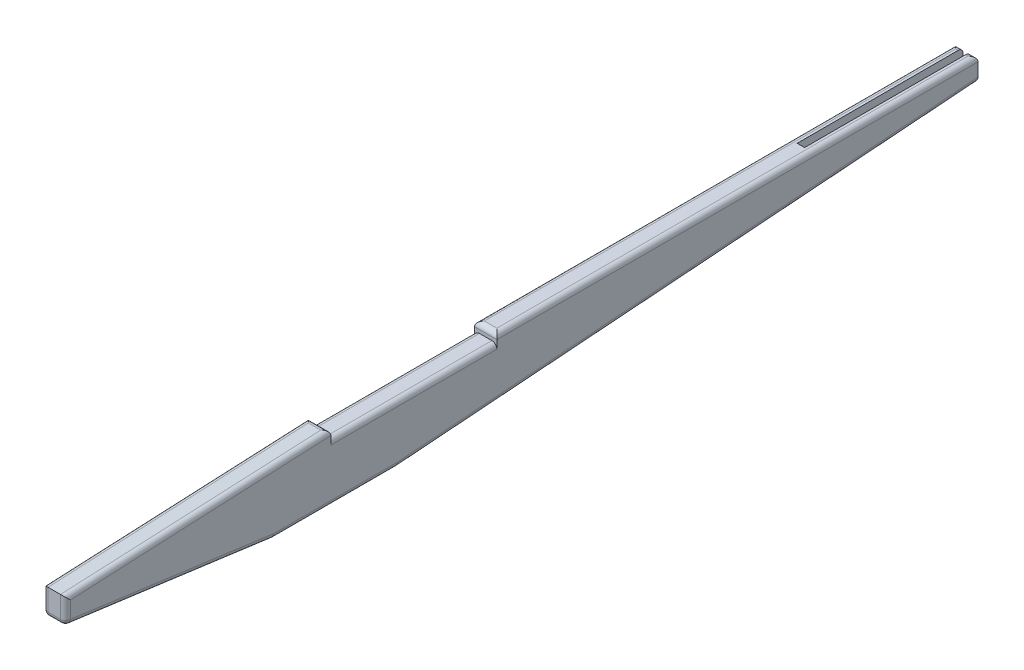
ISO-10303-21;
HEADER;
FILE_DESCRIPTION(('STEP AP214'),'2;1');
FILE_NAME('part.step','',(''),(''),'','','');
FILE_SCHEMA(('AUTOMOTIVE_DESIGN { 1 0 10303 214 1 1 1 1 }'));
ENDSEC;
DATA;
#1=APPLICATION_CONTEXT('core data for automotive mechanical design processes');
#2=APPLICATION_PROTOCOL_DEFINITION('international standard','automotive_design',2000,#1);
#3=PRODUCT_CONTEXT('',#1,'mechanical');
#4=PRODUCT('Part','Part','',(#3));
#5=PRODUCT_RELATED_PRODUCT_CATEGORY('part','',(#4));
#6=PRODUCT_DEFINITION_FORMATION('','',#4);
#7=PRODUCT_DEFINITION_CONTEXT('part definition',#1,'design');
#8=PRODUCT_DEFINITION('design','',#6,#7);
#9=PRODUCT_DEFINITION_SHAPE('','',#8);
#10=(LENGTH_UNIT() NAMED_UNIT(*) SI_UNIT(.MILLI.,.METRE.));
#11=(NAMED_UNIT(*) PLANE_ANGLE_UNIT() SI_UNIT($,.RADIAN.));
#12=(NAMED_UNIT(*) SI_UNIT($,.STERADIAN.) SOLID_ANGLE_UNIT());
#13=UNCERTAINTY_MEASURE_WITH_UNIT(LENGTH_MEASURE(1.E-05),#10,'distance_accuracy_value','');
#14=(GEOMETRIC_REPRESENTATION_CONTEXT(3) GLOBAL_UNCERTAINTY_ASSIGNED_CONTEXT((#13)) GLOBAL_UNIT_ASSIGNED_CONTEXT((#10,
#11,#12)) REPRESENTATION_CONTEXT('',''));
#15=CARTESIAN_POINT('',(0.,0.,0.));
#16=DIRECTION('',(0.,0.,1.));
#17=DIRECTION('',(1.,0.,0.));
#18=AXIS2_PLACEMENT_3D('',#15,#16,#17);
#19=CARTESIAN_POINT('',(13.5,32.5,0.));
#20=DIRECTION('',(0.,-0.998903174369838,-0.0468235862985862));
#21=DIRECTION('',(0.,0.0468235862985862,-0.998903174369838));
#22=AXIS2_PLACEMENT_3D('',#19,#20,#21);
#23=PLANE('',#22);
#24=DIRECTION('',(-1.,0.,0.));
#25=VECTOR('',#24,1.);
#26=CARTESIAN_POINT('',(13.5,39.8527904331768,-156.859529241104));
#27=LINE('',#26,#25);
#28=CARTESIAN_POINT('',(10.5,39.8527904331768,-156.859529241104));
#29=VERTEX_POINT('',#28);
#30=CARTESIAN_POINT('',(3.,39.8527904331768,-156.859529241104));
#31=VERTEX_POINT('',#30);
#32=EDGE_CURVE('E52',#29,#31,#27,.T.);
#33=ORIENTED_EDGE('',*,*,#32,.T.);
#34=DIRECTION('',(0.,-0.0468235862985862,0.998903174369838));
#35=VECTOR('',#34,1.);
#36=CARTESIAN_POINT('',(3.,32.5,0.));
#37=LINE('',#36,#35);
#38=CARTESIAN_POINT('',(3.,32.5,0.));
#39=VERTEX_POINT('',#38);
#40=EDGE_CURVE('E394',#31,#39,#37,.T.);
#41=ORIENTED_EDGE('',*,*,#40,.T.);
#42=DIRECTION('',(-1.,0.,0.));
#43=VECTOR('',#42,1.);
#44=CARTESIAN_POINT('',(13.5,32.5,0.));
#45=LINE('',#44,#43);
#46=CARTESIAN_POINT('',(10.5,32.5,0.));
#47=VERTEX_POINT('',#46);
#48=EDGE_CURVE('E293',#47,#39,#45,.T.);
#49=ORIENTED_EDGE('',*,*,#48,.F.);
#50=DIRECTION('',(0.,-0.0468235862985862,0.998903174369838));
#51=VECTOR('',#50,1.);
#52=CARTESIAN_POINT('',(10.5,32.5,0.));
#53=LINE('',#52,#51);
#54=EDGE_CURVE('E57',#47,#29,#53,.F.);
#55=ORIENTED_EDGE('',*,*,#54,.T.);
#56=EDGE_LOOP('',(#33,#41,#49,#55));
#57=FACE_BOUND('',#56,.T.);
#58=ADVANCED_FACE('F35',(#57),#23,.F.);
#59=CARTESIAN_POINT('',(13.5,16.9,0.));
#60=DIRECTION('',(0.,0.,-1.));
#61=DIRECTION('',(-1.,0.,0.));
#62=AXIS2_PLACEMENT_3D('',#59,#60,#61);
#63=PLANE('',#62);
#64=ORIENTED_EDGE('',*,*,#48,.T.);
#65=DIRECTION('',(0.,-1.,0.));
#66=VECTOR('',#65,1.);
#67=CARTESIAN_POINT('',(3.,16.9,0.));
#68=LINE('',#67,#66);
#69=CARTESIAN_POINT('',(3.,19.5225355480754,0.));
#70=VERTEX_POINT('',#69);
#71=EDGE_CURVE('E383',#39,#70,#68,.T.);
#72=ORIENTED_EDGE('',*,*,#71,.T.);
#73=DIRECTION('',(-1.,0.,0.));
#74=VECTOR('',#73,1.);
#75=CARTESIAN_POINT('',(13.5,19.5225355480754,0.));
#76=LINE('',#75,#74);
#77=CARTESIAN_POINT('',(10.5,19.5225355480754,0.));
#78=VERTEX_POINT('',#77);
#79=EDGE_CURVE('E380',#70,#78,#76,.F.);
#80=ORIENTED_EDGE('',*,*,#79,.T.);
#81=DIRECTION('',(0.,-1.,0.));
#82=VECTOR('',#81,1.);
#83=CARTESIAN_POINT('',(10.5,16.9,0.));
#84=LINE('',#83,#82);
#85=EDGE_CURVE('E378',#78,#47,#84,.F.);
#86=ORIENTED_EDGE('',*,*,#85,.T.);
#87=EDGE_LOOP('',(#64,#72,#80,#86));
#88=FACE_BOUND('',#87,.T.);
#89=ADVANCED_FACE('F485',(#88),#63,.F.);
#90=CARTESIAN_POINT('',(13.5,0.,-125.3));
#91=DIRECTION('',(0.,0.99102644098544,-0.133665976477685));
#92=DIRECTION('',(0.,0.133665976477685,0.99102644098544));
#93=AXIS2_PLACEMENT_3D('',#90,#91,#92);
#94=PLANE('',#93);
#95=DIRECTION('',(0.,-0.133665976477685,-0.99102644098544));
#96=VECTOR('',#95,1.);
#97=CARTESIAN_POINT('',(3.,0.,-125.3));
#98=LINE('',#97,#96);
#99=CARTESIAN_POINT('',(3.,16.5494562251191,-2.59900207056695));
#100=VERTEX_POINT('',#99);
#101=CARTESIAN_POINT('',(3.,0.026920677043683,-125.100404684404));
#102=VERTEX_POINT('',#101);
#103=EDGE_CURVE('E373',#100,#102,#98,.T.);
#104=ORIENTED_EDGE('',*,*,#103,.T.);
#105=DIRECTION('',(-1.,0.,0.));
#106=VECTOR('',#105,1.);
#107=CARTESIAN_POINT('',(13.5,0.026920677043683,-125.100404684404));
#108=LINE('',#107,#106);
#109=CARTESIAN_POINT('',(10.5,0.026920677043683,-125.100404684404));
#110=VERTEX_POINT('',#109);
#111=EDGE_CURVE('E375',#102,#110,#108,.F.);
#112=ORIENTED_EDGE('',*,*,#111,.T.);
#113=DIRECTION('',(0.,-0.133665976477685,-0.99102644098544));
#114=VECTOR('',#113,1.);
#115=CARTESIAN_POINT('',(10.5,0.,-125.3));
#116=LINE('',#115,#114);
#117=CARTESIAN_POINT('',(10.5,16.5494562251191,-2.59900207056695));
#118=VERTEX_POINT('',#117);
#119=EDGE_CURVE('E369',#110,#118,#116,.F.);
#120=ORIENTED_EDGE('',*,*,#119,.T.);
#121=DIRECTION('',(-1.,0.,0.));
#122=VECTOR('',#121,1.);
#123=CARTESIAN_POINT('',(13.5,16.5494562251191,-2.59900207056694));
#124=LINE('',#123,#122);
#125=EDGE_CURVE('E371',#118,#100,#124,.T.);
#126=ORIENTED_EDGE('',*,*,#125,.T.);
#127=EDGE_LOOP('',(#104,#112,#120,#126));
#128=FACE_BOUND('',#127,.T.);
#129=ADVANCED_FACE('F577',(#128),#94,.F.);
#130=CARTESIAN_POINT('',(13.5,0.,-200.));
#131=DIRECTION('',(0.,1.,0.));
#132=DIRECTION('',(0.,0.,1.));
#133=AXIS2_PLACEMENT_3D('',#130,#131,#132);
#134=PLANE('',#133);
#135=DIRECTION('',(-1.,0.,0.));
#136=VECTOR('',#135,1.);
#137=CARTESIAN_POINT('',(13.5,0.,-125.501402613837));
#138=LINE('',#137,#136);
#139=CARTESIAN_POINT('',(10.5,0.,-125.501402613837));
#140=VERTEX_POINT('',#139);
#141=CARTESIAN_POINT('',(3.,0.,-125.501402613837));
#142=VERTEX_POINT('',#141);
#143=EDGE_CURVE('E346',#140,#142,#138,.T.);
#144=ORIENTED_EDGE('',*,*,#143,.T.);
#145=DIRECTION('',(0.,0.,-1.));
#146=VECTOR('',#145,1.);
#147=CARTESIAN_POINT('',(3.,0.,-200.));
#148=LINE('',#147,#146);
#149=CARTESIAN_POINT('',(3.,0.,-200.));
#150=VERTEX_POINT('',#149);
#151=EDGE_CURVE('E350',#142,#150,#148,.T.);
#152=ORIENTED_EDGE('',*,*,#151,.T.);
#153=DIRECTION('',(-1.,0.,0.));
#154=VECTOR('',#153,1.);
#155=CARTESIAN_POINT('',(13.5,0.,-200.));
#156=LINE('',#155,#154);
#157=CARTESIAN_POINT('',(10.5,0.,-200.));
#158=VERTEX_POINT('',#157);
#159=EDGE_CURVE('E288',#158,#150,#156,.T.);
#160=ORIENTED_EDGE('',*,*,#159,.F.);
#161=DIRECTION('',(0.,0.,-1.));
#162=VECTOR('',#161,1.);
#163=CARTESIAN_POINT('',(10.5,0.,-200.));
#164=LINE('',#163,#162);
#165=EDGE_CURVE('E348',#158,#140,#164,.F.);
#166=ORIENTED_EDGE('',*,*,#165,.T.);
#167=EDGE_LOOP('',(#144,#152,#160,#166));
#168=FACE_BOUND('',#167,.T.);
#169=ADVANCED_FACE('F579',(#168),#134,.F.);
#170=CARTESIAN_POINT('',(13.5,26.,-550.));
#171=DIRECTION('',(0.,0.99725218370585,0.0740815907895774));
#172=DIRECTION('',(0.,-0.0740815907895774,0.99725218370585));
#173=AXIS2_PLACEMENT_3D('',#170,#171,#172);
#174=PLANE('',#173);
#175=ORIENTED_EDGE('',*,*,#159,.T.);
#176=DIRECTION('',(0.,0.0740815907895774,-0.99725218370585));
#177=VECTOR('',#176,1.);
#178=CARTESIAN_POINT('',(3.,26.,-550.));
#179=LINE('',#178,#177);
#180=CARTESIAN_POINT('',(3.,25.7936524688045,-547.222244772369));
#181=VERTEX_POINT('',#180);
#182=EDGE_CURVE('E327',#150,#181,#179,.T.);
#183=ORIENTED_EDGE('',*,*,#182,.T.);
#184=DIRECTION('',(-1.,0.,0.));
#185=VECTOR('',#184,1.);
#186=CARTESIAN_POINT('',(13.5,25.7936524688045,-547.222244772369));
#187=LINE('',#186,#185);
#188=CARTESIAN_POINT('',(10.5,25.7936524688045,-547.222244772369));
#189=VERTEX_POINT('',#188);
#190=EDGE_CURVE('E324',#181,#189,#187,.F.);
#191=ORIENTED_EDGE('',*,*,#190,.T.);
#192=DIRECTION('',(0.,0.0740815907895774,-0.99725218370585));
#193=VECTOR('',#192,1.);
#194=CARTESIAN_POINT('',(10.5,26.,-550.));
#195=LINE('',#194,#193);
#196=EDGE_CURVE('E322',#189,#158,#195,.F.);
#197=ORIENTED_EDGE('',*,*,#196,.T.);
#198=EDGE_LOOP('',(#175,#183,#191,#197));
#199=FACE_BOUND('',#198,.T.);
#200=ADVANCED_FACE('F585',(#199),#174,.F.);
#201=CARTESIAN_POINT('',(13.5,40.,-550.));
#202=DIRECTION('',(0.,0.,1.));
#203=DIRECTION('',(1.,0.,0.));
#204=AXIS2_PLACEMENT_3D('',#201,#202,#203);
#205=PLANE('',#204);
#206=DIRECTION('',(0.,1.,0.));
#207=VECTOR('',#206,1.);
#208=CARTESIAN_POINT('',(9.,35.,-550.));
#209=LINE('',#208,#207);
#210=CARTESIAN_POINT('',(9.,35.,-550.));
#211=VERTEX_POINT('',#210);
#212=CARTESIAN_POINT('',(9.,37.,-550.));
#213=VERTEX_POINT('',#212);
#214=EDGE_CURVE('E265',#211,#213,#209,.T.);
#215=ORIENTED_EDGE('',*,*,#214,.T.);
#216=DIRECTION('',(-1.,0.,0.));
#217=VECTOR('',#216,1.);
#218=CARTESIAN_POINT('',(13.5,37.,-550.));
#219=LINE('',#218,#217);
#220=CARTESIAN_POINT('',(13.5,37.,-550.));
#221=VERTEX_POINT('',#220);
#222=EDGE_CURVE('E318',#213,#221,#219,.F.);
#223=ORIENTED_EDGE('',*,*,#222,.T.);
#224=DIRECTION('',(0.,1.,0.));
#225=VECTOR('',#224,1.);
#226=CARTESIAN_POINT('',(13.5,40.,-550.));
#227=LINE('',#226,#225);
#228=CARTESIAN_POINT('',(13.5,29.0082661627792,-550.));
#229=VERTEX_POINT('',#228);
#230=EDGE_CURVE('E285',#229,#221,#227,.T.);
#231=ORIENTED_EDGE('',*,*,#230,.F.);
#232=CARTESIAN_POINT('',(10.5,29.0082661627792,-550.));
#233=DIRECTION('',(0.,0.,1.));
#234=DIRECTION('',(0.,1.,0.));
#235=AXIS2_PLACEMENT_3D('',#232,#233,#234);
#236=ELLIPSE('',#235,3.00826616277923,3.);
#237=CARTESIAN_POINT('',(13.4917565511175,28.7854090199221,-550.));
#238=VERTEX_POINT('',#237);
#239=EDGE_CURVE('E309',#229,#238,#236,.F.);
#240=ORIENTED_EDGE('',*,*,#239,.T.);
#241=DIRECTION('',(-1.,0.,0.));
#242=VECTOR('',#241,1.);
#243=CARTESIAN_POINT('',(13.5,28.7854090199221,-550.));
#244=LINE('',#243,#242);
#245=CARTESIAN_POINT('',(0.00824344888245183,28.7854090199221,-550.));
#246=VERTEX_POINT('',#245);
#247=EDGE_CURVE('E311',#238,#246,#244,.T.);
#248=ORIENTED_EDGE('',*,*,#247,.T.);
#249=CARTESIAN_POINT('',(3.,29.0082661627792,-550.));
#250=DIRECTION('',(0.,0.,1.));
#251=DIRECTION('',(0.,-1.,0.));
#252=AXIS2_PLACEMENT_3D('',#249,#250,#251);
#253=ELLIPSE('',#252,3.00826616277923,3.);
#254=CARTESIAN_POINT('',(0.,29.0082661627792,-550.));
#255=VERTEX_POINT('',#254);
#256=EDGE_CURVE('E314',#246,#255,#253,.F.);
#257=ORIENTED_EDGE('',*,*,#256,.T.);
#258=DIRECTION('',(0.,1.,0.));
#259=VECTOR('',#258,1.);
#260=CARTESIAN_POINT('',(0.,40.,-550.));
#261=LINE('',#260,#259);
#262=CARTESIAN_POINT('',(0.,37.,-550.));
#263=VERTEX_POINT('',#262);
#264=EDGE_CURVE('E282',#255,#263,#261,.T.);
#265=ORIENTED_EDGE('',*,*,#264,.T.);
#266=DIRECTION('',(-1.,0.,0.));
#267=VECTOR('',#266,1.);
#268=CARTESIAN_POINT('',(13.5,37.,-550.));
#269=LINE('',#268,#267);
#270=CARTESIAN_POINT('',(4.5,37.,-550.));
#271=VERTEX_POINT('',#270);
#272=EDGE_CURVE('E316',#263,#271,#269,.F.);
#273=ORIENTED_EDGE('',*,*,#272,.T.);
#274=DIRECTION('',(0.,1.,0.));
#275=VECTOR('',#274,1.);
#276=CARTESIAN_POINT('',(4.5,35.,-550.));
#277=LINE('',#276,#275);
#278=CARTESIAN_POINT('',(4.5,35.,-550.));
#279=VERTEX_POINT('',#278);
#280=EDGE_CURVE('E262',#279,#271,#277,.T.);
#281=ORIENTED_EDGE('',*,*,#280,.F.);
#282=DIRECTION('',(-1.,0.,0.));
#283=VECTOR('',#282,1.);
#284=CARTESIAN_POINT('',(4.5,35.,-550.));
#285=LINE('',#284,#283);
#286=EDGE_CURVE('E238',#211,#279,#285,.T.);
#287=ORIENTED_EDGE('',*,*,#286,.F.);
#288=EDGE_LOOP('',(#215,#223,#231,#240,#248,#257,#265,#273,#281,#287));
#289=FACE_BOUND('',#288,.T.);
#290=ADVANCED_FACE('F541',(#289),#205,.F.);
#291=CARTESIAN_POINT('',(13.5,40.,-160.));
#292=DIRECTION('',(0.,-1.,0.));
#293=DIRECTION('',(0.,0.,-1.));
#294=AXIS2_PLACEMENT_3D('',#291,#292,#293);
#295=PLANE('',#294);
#296=DIRECTION('',(0.,0.,1.));
#297=VECTOR('',#296,1.);
#298=CARTESIAN_POINT('',(10.5,40.,-160.));
#299=LINE('',#298,#297);
#300=CARTESIAN_POINT('',(10.5,40.,-263.));
#301=VERTEX_POINT('',#300);
#302=CARTESIAN_POINT('',(10.5,40.,-547.));
#303=VERTEX_POINT('',#302);
#304=EDGE_CURVE('E298',#301,#303,#299,.F.);
#305=ORIENTED_EDGE('',*,*,#304,.T.);
#306=DIRECTION('',(-1.,0.,0.));
#307=VECTOR('',#306,1.);
#308=CARTESIAN_POINT('',(13.5,40.,-547.));
#309=LINE('',#308,#307);
#310=CARTESIAN_POINT('',(9.,40.,-547.));
#311=VERTEX_POINT('',#310);
#312=EDGE_CURVE('E304',#303,#311,#309,.T.);
#313=ORIENTED_EDGE('',*,*,#312,.T.);
#314=DIRECTION('',(0.,0.,-1.));
#315=VECTOR('',#314,1.);
#316=CARTESIAN_POINT('',(9.,40.,-550.));
#317=LINE('',#316,#315);
#318=CARTESIAN_POINT('',(9.00000000000001,40.,-450.));
#319=VERTEX_POINT('',#318);
#320=EDGE_CURVE('E251',#319,#311,#317,.T.);
#321=ORIENTED_EDGE('',*,*,#320,.F.);
#322=DIRECTION('',(1.,0.,0.));
#323=VECTOR('',#322,1.);
#324=CARTESIAN_POINT('',(4.50000000000001,40.,-450.));
#325=LINE('',#324,#323);
#326=CARTESIAN_POINT('',(4.50000000000001,40.,-450.));
#327=VERTEX_POINT('',#326);
#328=EDGE_CURVE('E254',#327,#319,#325,.T.);
#329=ORIENTED_EDGE('',*,*,#328,.F.);
#330=DIRECTION('',(0.,0.,1.));
#331=VECTOR('',#330,1.);
#332=CARTESIAN_POINT('',(4.5,40.,-550.));
#333=LINE('',#332,#331);
#334=CARTESIAN_POINT('',(4.5,40.,-547.));
#335=VERTEX_POINT('',#334);
#336=EDGE_CURVE('E233',#335,#327,#333,.T.);
#337=ORIENTED_EDGE('',*,*,#336,.F.);
#338=DIRECTION('',(-1.,0.,0.));
#339=VECTOR('',#338,1.);
#340=CARTESIAN_POINT('',(13.5,40.,-547.));
#341=LINE('',#340,#339);
#342=CARTESIAN_POINT('',(3.,40.,-547.));
#343=VERTEX_POINT('',#342);
#344=EDGE_CURVE('E302',#335,#343,#341,.T.);
#345=ORIENTED_EDGE('',*,*,#344,.T.);
#346=DIRECTION('',(0.,0.,1.));
#347=VECTOR('',#346,1.);
#348=CARTESIAN_POINT('',(3.,40.,-260.));
#349=LINE('',#348,#347);
#350=CARTESIAN_POINT('',(3.,40.,-263.));
#351=VERTEX_POINT('',#350);
#352=EDGE_CURVE('E300',#343,#351,#349,.T.);
#353=ORIENTED_EDGE('',*,*,#352,.T.);
#354=DIRECTION('',(1.,0.,0.));
#355=VECTOR('',#354,1.);
#356=CARTESIAN_POINT('',(13.5,40.,-263.));
#357=LINE('',#356,#355);
#358=EDGE_CURVE('E296',#351,#301,#357,.T.);
#359=ORIENTED_EDGE('',*,*,#358,.T.);
#360=EDGE_LOOP('',(#305,#313,#321,#329,#337,#345,#353,#359));
#361=FACE_BOUND('',#360,.T.);
#362=ADVANCED_FACE('F672',(#361),#295,.F.);
#363=CARTESIAN_POINT('',(13.5,0.,0.));
#364=DIRECTION('',(-1.,0.,0.));
#365=DIRECTION('',(0.,0.,1.));
#366=AXIS2_PLACEMENT_3D('',#363,#364,#365);
#367=PLANE('',#366);
#368=DIRECTION('',(0.,1.,0.));
#369=VECTOR('',#368,1.);
#370=CARTESIAN_POINT('',(13.5,40.,-260.));
#371=LINE('',#370,#369);
#372=CARTESIAN_POINT('',(13.5,32.,-260.));
#373=VERTEX_POINT('',#372);
#374=CARTESIAN_POINT('',(13.5,37.,-260.));
#375=VERTEX_POINT('',#374);
#376=EDGE_CURVE('E272',#373,#375,#371,.T.);
#377=ORIENTED_EDGE('',*,*,#376,.F.);
#378=DIRECTION('',(0.,0.,-1.));
#379=VECTOR('',#378,1.);
#380=CARTESIAN_POINT('',(13.5,32.,0.));
#381=LINE('',#380,#379);
#382=CARTESIAN_POINT('',(13.5,32.,-160.));
#383=VERTEX_POINT('',#382);
#384=EDGE_CURVE('E366',#373,#383,#381,.F.);
#385=ORIENTED_EDGE('',*,*,#384,.T.);
#386=DIRECTION('',(0.,-1.,0.));
#387=VECTOR('',#386,1.);
#388=CARTESIAN_POINT('',(13.5,40.,-160.));
#389=LINE('',#388,#387);
#390=CARTESIAN_POINT('',(13.5,36.8560809100672,-160.));
#391=VERTEX_POINT('',#390);
#392=EDGE_CURVE('E264',#391,#383,#389,.T.);
#393=ORIENTED_EDGE('',*,*,#392,.F.);
#394=CARTESIAN_POINT('',(13.5,36.8560809100672,-157.));
#395=DIRECTION('',(-1.,0.,0.));
#396=DIRECTION('',(0.,0.,1.));
#397=AXIS2_PLACEMENT_3D('',#394,#395,#396);
#398=CIRCLE('',#397,3.);
#399=CARTESIAN_POINT('',(13.5,36.996551668963,-159.99670952311));
#400=VERTEX_POINT('',#399);
#401=EDGE_CURVE('E354',#391,#400,#398,.F.);
#402=ORIENTED_EDGE('',*,*,#401,.T.);
#403=DIRECTION('',(0.,-0.0468235862985862,0.998903174369838));
#404=VECTOR('',#403,1.);
#405=CARTESIAN_POINT('',(13.5,29.43203590929,1.37962668324797));
#406=LINE('',#405,#404);
#407=CARTESIAN_POINT('',(13.5,29.6373309100672,-3.));
#408=VERTEX_POINT('',#407);
#409=EDGE_CURVE('E352',#400,#408,#406,.T.);
#410=ORIENTED_EDGE('',*,*,#409,.T.);
#411=DIRECTION('',(0.,-1.,0.));
#412=VECTOR('',#411,1.);
#413=CARTESIAN_POINT('',(13.5,0.,-3.));
#414=LINE('',#413,#412);
#415=CARTESIAN_POINT('',(13.5,19.5225355480754,-3.));
#416=VERTEX_POINT('',#415);
#417=EDGE_CURVE('E356',#408,#416,#414,.T.);
#418=ORIENTED_EDGE('',*,*,#417,.T.);
#419=DIRECTION('',(0.,-0.133665976477685,-0.99102644098544));
#420=VECTOR('',#419,1.);
#421=CARTESIAN_POINT('',(13.5,19.5711338967316,-2.63968206588));
#422=LINE('',#421,#420);
#423=CARTESIAN_POINT('',(13.5,3.,-125.501402613837));
#424=VERTEX_POINT('',#423);
#425=EDGE_CURVE('E358',#416,#424,#422,.T.);
#426=ORIENTED_EDGE('',*,*,#425,.T.);
#427=DIRECTION('',(0.,0.,-1.));
#428=VECTOR('',#427,1.);
#429=CARTESIAN_POINT('',(13.5,3.00000000000001,0.));
#430=LINE('',#429,#428);
#431=CARTESIAN_POINT('',(13.5,3.,-199.888724731818));
#432=VERTEX_POINT('',#431);
#433=EDGE_CURVE('E360',#424,#432,#430,.T.);
#434=ORIENTED_EDGE('',*,*,#433,.T.);
#435=DIRECTION('',(0.,0.0740815907895774,-0.99725218370585));
#436=VECTOR('',#435,1.);
#437=CARTESIAN_POINT('',(13.5,-11.7838490863443,-0.875371646414147));
#438=LINE('',#437,#436);
#439=EDGE_CURVE('E362',#432,#229,#438,.T.);
#440=ORIENTED_EDGE('',*,*,#439,.T.);
#441=ORIENTED_EDGE('',*,*,#230,.T.);
#442=DIRECTION('',(0.,0.,1.));
#443=VECTOR('',#442,1.);
#444=CARTESIAN_POINT('',(13.5,37.,0.));
#445=LINE('',#444,#443);
#446=EDGE_CURVE('E364',#221,#375,#445,.T.);
#447=ORIENTED_EDGE('',*,*,#446,.T.);
#448=EDGE_LOOP('',(#377,#385,#393,#402,#410,#418,#426,#434,#440,#441,#447));
#449=FACE_BOUND('',#448,.T.);
#450=ADVANCED_FACE('F494',(#449),#367,.F.);
#451=CARTESIAN_POINT('',(0.,0.,0.));
#452=DIRECTION('',(-1.,0.,0.));
#453=DIRECTION('',(0.,0.,1.));
#454=AXIS2_PLACEMENT_3D('',#451,#452,#453);
#455=PLANE('',#454);
#456=DIRECTION('',(0.,0.,-1.));
#457=VECTOR('',#456,1.);
#458=CARTESIAN_POINT('',(0.,32.,-260.));
#459=LINE('',#458,#457);
#460=CARTESIAN_POINT('',(0.,32.,-160.));
#461=VERTEX_POINT('',#460);
#462=CARTESIAN_POINT('',(0.,32.,-260.));
#463=VERTEX_POINT('',#462);
#464=EDGE_CURVE('E343',#461,#463,#459,.T.);
#465=ORIENTED_EDGE('',*,*,#464,.T.);
#466=DIRECTION('',(0.,1.,0.));
#467=VECTOR('',#466,1.);
#468=CARTESIAN_POINT('',(0.,40.,-260.));
#469=LINE('',#468,#467);
#470=CARTESIAN_POINT('',(0.,37.,-260.));
#471=VERTEX_POINT('',#470);
#472=EDGE_CURVE('E271',#463,#471,#469,.T.);
#473=ORIENTED_EDGE('',*,*,#472,.T.);
#474=DIRECTION('',(0.,0.,1.));
#475=VECTOR('',#474,1.);
#476=CARTESIAN_POINT('',(0.,37.,-550.));
#477=LINE('',#476,#475);
#478=EDGE_CURVE('E341',#471,#263,#477,.F.);
#479=ORIENTED_EDGE('',*,*,#478,.T.);
#480=ORIENTED_EDGE('',*,*,#264,.F.);
#481=DIRECTION('',(0.,0.0740815907895774,-0.99725218370585));
#482=VECTOR('',#481,1.);
#483=CARTESIAN_POINT('',(0.,2.99175655111754,-199.777755227631));
#484=LINE('',#483,#482);
#485=CARTESIAN_POINT('',(0.,3.,-199.888724731818));
#486=VERTEX_POINT('',#485);
#487=EDGE_CURVE('E339',#255,#486,#484,.F.);
#488=ORIENTED_EDGE('',*,*,#487,.T.);
#489=DIRECTION('',(0.,0.,-1.));
#490=VECTOR('',#489,1.);
#491=CARTESIAN_POINT('',(0.,3.,-125.3));
#492=LINE('',#491,#490);
#493=CARTESIAN_POINT('',(0.,3.,-125.501402613837));
#494=VERTEX_POINT('',#493);
#495=EDGE_CURVE('E337',#486,#494,#492,.F.);
#496=ORIENTED_EDGE('',*,*,#495,.T.);
#497=DIRECTION('',(0.,-0.133665976477685,-0.99102644098544));
#498=VECTOR('',#497,1.);
#499=CARTESIAN_POINT('',(0.,19.8730793229563,-0.400997929432989));
#500=LINE('',#499,#498);
#501=CARTESIAN_POINT('',(0.,19.5225355480754,-3.));
#502=VERTEX_POINT('',#501);
#503=EDGE_CURVE('E335',#494,#502,#500,.F.);
#504=ORIENTED_EDGE('',*,*,#503,.T.);
#505=DIRECTION('',(0.,-1.,0.));
#506=VECTOR('',#505,1.);
#507=CARTESIAN_POINT('',(0.,32.5,-3.));
#508=LINE('',#507,#506);
#509=CARTESIAN_POINT('',(0.,29.6373309100672,-3.));
#510=VERTEX_POINT('',#509);
#511=EDGE_CURVE('E333',#502,#510,#508,.F.);
#512=ORIENTED_EDGE('',*,*,#511,.T.);
#513=DIRECTION('',(0.,-0.0468235862985862,0.998903174369838));
#514=VECTOR('',#513,1.);
#515=CARTESIAN_POINT('',(0.,37.0032904768905,-160.140470758896));
#516=LINE('',#515,#514);
#517=CARTESIAN_POINT('',(0.,36.996551668963,-159.99670952311));
#518=VERTEX_POINT('',#517);
#519=EDGE_CURVE('E329',#510,#518,#516,.F.);
#520=ORIENTED_EDGE('',*,*,#519,.T.);
#521=CARTESIAN_POINT('',(0.,36.8560809100672,-157.));
#522=DIRECTION('',(-1.,0.,0.));
#523=DIRECTION('',(0.,0.,1.));
#524=AXIS2_PLACEMENT_3D('',#521,#522,#523);
#525=CIRCLE('',#524,3.);
#526=CARTESIAN_POINT('',(0.,36.8560809100672,-160.));
#527=VERTEX_POINT('',#526);
#528=EDGE_CURVE('E331',#518,#527,#525,.T.);
#529=ORIENTED_EDGE('',*,*,#528,.T.);
#530=DIRECTION('',(0.,-1.,0.));
#531=VECTOR('',#530,1.);
#532=CARTESIAN_POINT('',(0.,40.,-160.));
#533=LINE('',#532,#531);
#534=EDGE_CURVE('E269',#527,#461,#533,.T.);
#535=ORIENTED_EDGE('',*,*,#534,.T.);
#536=EDGE_LOOP('',(#465,#473,#479,#480,#488,#496,#504,#512,#520,#529,#535));
#537=FACE_BOUND('',#536,.T.);
#538=ADVANCED_FACE('F507',(#537),#455,.T.);
#539=CARTESIAN_POINT('',(0.,40.,-160.));
#540=DIRECTION('',(0.,0.,1.));
#541=DIRECTION('',(1.,0.,0.));
#542=AXIS2_PLACEMENT_3D('',#539,#540,#541);
#543=PLANE('',#542);
#544=ORIENTED_EDGE('',*,*,#534,.F.);
#545=DIRECTION('',(-1.,0.,0.));
#546=VECTOR('',#545,1.);
#547=CARTESIAN_POINT('',(0.,36.8560809100672,-160.));
#548=LINE('',#547,#546);
#549=EDGE_CURVE('E396',#527,#391,#548,.F.);
#550=ORIENTED_EDGE('',*,*,#549,.T.);
#551=ORIENTED_EDGE('',*,*,#392,.T.);
#552=CARTESIAN_POINT('',(10.5,32.,-160.));
#553=DIRECTION('',(0.,0.,1.));
#554=DIRECTION('',(1.,0.,0.));
#555=AXIS2_PLACEMENT_3D('',#552,#553,#554);
#556=CIRCLE('',#555,3.);
#557=CARTESIAN_POINT('',(10.5,35.,-160.));
#558=VERTEX_POINT('',#557);
#559=EDGE_CURVE('E11',#383,#558,#556,.T.);
#560=ORIENTED_EDGE('',*,*,#559,.T.);
#561=DIRECTION('',(1.,0.,0.));
#562=VECTOR('',#561,1.);
#563=CARTESIAN_POINT('',(0.,35.,-160.));
#564=LINE('',#563,#562);
#565=CARTESIAN_POINT('',(3.,35.,-160.));
#566=VERTEX_POINT('',#565);
#567=EDGE_CURVE('E275',#566,#558,#564,.T.);
#568=ORIENTED_EDGE('',*,*,#567,.F.);
#569=CARTESIAN_POINT('',(3.,32.,-160.));
#570=DIRECTION('',(0.,0.,1.));
#571=DIRECTION('',(1.,0.,0.));
#572=AXIS2_PLACEMENT_3D('',#569,#570,#571);
#573=CIRCLE('',#572,3.);
#574=EDGE_CURVE('E400',#566,#461,#573,.T.);
#575=ORIENTED_EDGE('',*,*,#574,.T.);
#576=EDGE_LOOP('',(#544,#550,#551,#560,#568,#575));
#577=FACE_BOUND('',#576,.T.);
#578=ADVANCED_FACE('F502',(#577),#543,.F.);
#579=CARTESIAN_POINT('',(0.,40.,-260.));
#580=DIRECTION('',(0.,0.,-1.));
#581=DIRECTION('',(-1.,0.,0.));
#582=AXIS2_PLACEMENT_3D('',#579,#580,#581);
#583=PLANE('',#582);
#584=ORIENTED_EDGE('',*,*,#376,.T.);
#585=DIRECTION('',(1.,0.,0.));
#586=VECTOR('',#585,1.);
#587=CARTESIAN_POINT('',(0.,37.,-260.));
#588=LINE('',#587,#586);
#589=EDGE_CURVE('E390',#375,#471,#588,.F.);
#590=ORIENTED_EDGE('',*,*,#589,.T.);
#591=ORIENTED_EDGE('',*,*,#472,.F.);
#592=CARTESIAN_POINT('',(3.,32.,-260.));
#593=DIRECTION('',(0.,0.,-1.));
#594=DIRECTION('',(-1.,0.,0.));
#595=AXIS2_PLACEMENT_3D('',#592,#593,#594);
#596=CIRCLE('',#595,3.);
#597=CARTESIAN_POINT('',(3.,35.,-260.));
#598=VERTEX_POINT('',#597);
#599=EDGE_CURVE('E398',#463,#598,#596,.T.);
#600=ORIENTED_EDGE('',*,*,#599,.T.);
#601=DIRECTION('',(1.,0.,0.));
#602=VECTOR('',#601,1.);
#603=CARTESIAN_POINT('',(0.,35.,-260.));
#604=LINE('',#603,#602);
#605=CARTESIAN_POINT('',(10.5,35.,-260.));
#606=VERTEX_POINT('',#605);
#607=EDGE_CURVE('E279',#598,#606,#604,.T.);
#608=ORIENTED_EDGE('',*,*,#607,.T.);
#609=CARTESIAN_POINT('',(10.5,32.,-260.));
#610=DIRECTION('',(0.,0.,-1.));
#611=DIRECTION('',(-1.,0.,0.));
#612=AXIS2_PLACEMENT_3D('',#609,#610,#611);
#613=CIRCLE('',#612,3.);
#614=EDGE_CURVE('E44',#606,#373,#613,.T.);
#615=ORIENTED_EDGE('',*,*,#614,.T.);
#616=EDGE_LOOP('',(#584,#590,#591,#600,#608,#615));
#617=FACE_BOUND('',#616,.T.);
#618=ADVANCED_FACE('F660',(#617),#583,.F.);
#619=CARTESIAN_POINT('',(0.,35.,-160.));
#620=DIRECTION('',(0.,-1.,0.));
#621=DIRECTION('',(0.,0.,-1.));
#622=AXIS2_PLACEMENT_3D('',#619,#620,#621);
#623=PLANE('',#622);
#624=ORIENTED_EDGE('',*,*,#607,.F.);
#625=DIRECTION('',(0.,0.,-1.));
#626=VECTOR('',#625,1.);
#627=CARTESIAN_POINT('',(3.,35.,-160.));
#628=LINE('',#627,#626);
#629=EDGE_CURVE('E388',#598,#566,#628,.F.);
#630=ORIENTED_EDGE('',*,*,#629,.T.);
#631=ORIENTED_EDGE('',*,*,#567,.T.);
#632=DIRECTION('',(0.,0.,-1.));
#633=VECTOR('',#632,1.);
#634=CARTESIAN_POINT('',(10.5,35.,-160.));
#635=LINE('',#634,#633);
#636=EDGE_CURVE('E385',#558,#606,#635,.T.);
#637=ORIENTED_EDGE('',*,*,#636,.T.);
#638=EDGE_LOOP('',(#624,#630,#631,#637));
#639=FACE_BOUND('',#638,.T.);
#640=ADVANCED_FACE('F662',(#639),#623,.F.);
#641=CARTESIAN_POINT('',(4.5,35.,-550.));
#642=DIRECTION('',(-1.,0.,0.));
#643=DIRECTION('',(0.,0.,1.));
#644=AXIS2_PLACEMENT_3D('',#641,#642,#643);
#645=PLANE('',#644);
#646=ORIENTED_EDGE('',*,*,#280,.T.);
#647=CARTESIAN_POINT('',(4.5,37.,-547.));
#648=DIRECTION('',(-1.,0.,0.));
#649=DIRECTION('',(0.,0.,1.));
#650=AXIS2_PLACEMENT_3D('',#647,#648,#649);
#651=CIRCLE('',#650,3.);
#652=EDGE_CURVE('E320',#271,#335,#651,.F.);
#653=ORIENTED_EDGE('',*,*,#652,.T.);
#654=ORIENTED_EDGE('',*,*,#336,.T.);
#655=DIRECTION('',(0.,1.,0.));
#656=VECTOR('',#655,1.);
#657=CARTESIAN_POINT('',(4.50000000000001,35.,-450.));
#658=LINE('',#657,#656);
#659=CARTESIAN_POINT('',(4.50000000000001,35.,-450.));
#660=VERTEX_POINT('',#659);
#661=EDGE_CURVE('E225',#660,#327,#658,.T.);
#662=ORIENTED_EDGE('',*,*,#661,.F.);
#663=DIRECTION('',(0.,0.,1.));
#664=VECTOR('',#663,1.);
#665=CARTESIAN_POINT('',(4.5,35.,-550.));
#666=LINE('',#665,#664);
#667=EDGE_CURVE('E230',#279,#660,#666,.T.);
#668=ORIENTED_EDGE('',*,*,#667,.F.);
#669=EDGE_LOOP('',(#646,#653,#654,#662,#668));
#670=FACE_BOUND('',#669,.T.);
#671=ADVANCED_FACE('F228',(#670),#645,.F.);
#672=CARTESIAN_POINT('',(9.,35.,-550.));
#673=DIRECTION('',(1.,0.,0.));
#674=DIRECTION('',(0.,0.,-1.));
#675=AXIS2_PLACEMENT_3D('',#672,#673,#674);
#676=PLANE('',#675);
#677=ORIENTED_EDGE('',*,*,#320,.T.);
#678=CARTESIAN_POINT('',(9.,37.,-547.));
#679=DIRECTION('',(1.,0.,0.));
#680=DIRECTION('',(0.,0.,-1.));
#681=AXIS2_PLACEMENT_3D('',#678,#679,#680);
#682=CIRCLE('',#681,3.);
#683=EDGE_CURVE('E307',#311,#213,#682,.F.);
#684=ORIENTED_EDGE('',*,*,#683,.T.);
#685=ORIENTED_EDGE('',*,*,#214,.F.);
#686=DIRECTION('',(0.,0.,-1.));
#687=VECTOR('',#686,1.);
#688=CARTESIAN_POINT('',(9.,35.,-550.));
#689=LINE('',#688,#687);
#690=CARTESIAN_POINT('',(9.00000000000001,35.,-450.));
#691=VERTEX_POINT('',#690);
#692=EDGE_CURVE('E246',#691,#211,#689,.T.);
#693=ORIENTED_EDGE('',*,*,#692,.F.);
#694=DIRECTION('',(0.,1.,0.));
#695=VECTOR('',#694,1.);
#696=CARTESIAN_POINT('',(9.00000000000001,35.,-450.));
#697=LINE('',#696,#695);
#698=EDGE_CURVE('E237',#691,#319,#697,.T.);
#699=ORIENTED_EDGE('',*,*,#698,.T.);
#700=EDGE_LOOP('',(#677,#684,#685,#693,#699));
#701=FACE_BOUND('',#700,.T.);
#702=ADVANCED_FACE('F679',(#701),#676,.F.);
#703=CARTESIAN_POINT('',(4.50000000000001,35.,-450.));
#704=DIRECTION('',(0.,0.,1.));
#705=DIRECTION('',(1.,0.,0.));
#706=AXIS2_PLACEMENT_3D('',#703,#704,#705);
#707=PLANE('',#706);
#708=ORIENTED_EDGE('',*,*,#328,.T.);
#709=ORIENTED_EDGE('',*,*,#698,.F.);
#710=DIRECTION('',(1.,0.,0.));
#711=VECTOR('',#710,1.);
#712=CARTESIAN_POINT('',(4.50000000000001,35.,-450.));
#713=LINE('',#712,#711);
#714=EDGE_CURVE('E241',#660,#691,#713,.T.);
#715=ORIENTED_EDGE('',*,*,#714,.F.);
#716=ORIENTED_EDGE('',*,*,#661,.T.);
#717=EDGE_LOOP('',(#708,#709,#715,#716));
#718=FACE_BOUND('',#717,.T.);
#719=ADVANCED_FACE('F242',(#718),#707,.F.);
#720=CARTESIAN_POINT('',(0.,35.,0.));
#721=DIRECTION('',(0.,1.,0.));
#722=DIRECTION('',(0.,0.,1.));
#723=AXIS2_PLACEMENT_3D('',#720,#721,#722);
#724=PLANE('',#723);
#725=ORIENTED_EDGE('',*,*,#667,.T.);
#726=ORIENTED_EDGE('',*,*,#714,.T.);
#727=ORIENTED_EDGE('',*,*,#692,.T.);
#728=ORIENTED_EDGE('',*,*,#286,.T.);
#729=EDGE_LOOP('',(#725,#726,#727,#728));
#730=FACE_BOUND('',#729,.T.);
#731=ADVANCED_FACE('F248',(#730),#724,.T.);
#732=CARTESIAN_POINT('',(13.5,37.,-547.));
#733=DIRECTION('',(-1.,0.,0.));
#734=DIRECTION('',(0.,0.,1.));
#735=AXIS2_PLACEMENT_3D('',#732,#733,#734);
#736=CYLINDRICAL_SURFACE('',#735,3.);
#737=ORIENTED_EDGE('',*,*,#652,.F.);
#738=ORIENTED_EDGE('',*,*,#272,.F.);
#739=CARTESIAN_POINT('',(3.,37.,-547.));
#740=DIRECTION('',(0.707106781186547,0.,-0.707106781186547));
#741=DIRECTION('',(-0.707106781186547,0.,-0.707106781186547));
#742=AXIS2_PLACEMENT_3D('',#739,#740,#741);
#743=ELLIPSE('',#742,4.24264068711928,3.);
#744=EDGE_CURVE('E260',#343,#263,#743,.F.);
#745=ORIENTED_EDGE('',*,*,#744,.F.);
#746=ORIENTED_EDGE('',*,*,#344,.F.);
#747=EDGE_LOOP('',(#737,#738,#745,#746));
#748=FACE_BOUND('',#747,.T.);
#749=ADVANCED_FACE('F609',(#748),#736,.T.);
#750=CARTESIAN_POINT('',(3.,37.,-160.));
#751=DIRECTION('',(0.,0.,-1.));
#752=DIRECTION('',(-1.,0.,0.));
#753=AXIS2_PLACEMENT_3D('',#750,#751,#752);
#754=CYLINDRICAL_SURFACE('',#753,3.);
#755=ORIENTED_EDGE('',*,*,#744,.T.);
#756=ORIENTED_EDGE('',*,*,#478,.F.);
#757=CARTESIAN_POINT('',(3.,37.,-263.));
#758=DIRECTION('',(0.707106781186547,0.,0.707106781186547));
#759=DIRECTION('',(0.707106781186547,0.,-0.707106781186547));
#760=AXIS2_PLACEMENT_3D('',#757,#758,#759);
#761=ELLIPSE('',#760,4.24264068711928,3.);
#762=EDGE_CURVE('E411',#351,#471,#761,.T.);
#763=ORIENTED_EDGE('',*,*,#762,.F.);
#764=ORIENTED_EDGE('',*,*,#352,.F.);
#765=EDGE_LOOP('',(#755,#756,#763,#764));
#766=FACE_BOUND('',#765,.T.);
#767=ADVANCED_FACE('F605',(#766),#754,.T.);
#768=CARTESIAN_POINT('',(13.5,37.,-263.));
#769=DIRECTION('',(1.,0.,0.));
#770=DIRECTION('',(0.,0.,-1.));
#771=AXIS2_PLACEMENT_3D('',#768,#769,#770);
#772=CYLINDRICAL_SURFACE('',#771,3.);
#773=ORIENTED_EDGE('',*,*,#762,.T.);
#774=ORIENTED_EDGE('',*,*,#589,.F.);
#775=CARTESIAN_POINT('',(10.5,37.,-263.));
#776=DIRECTION('',(0.707106781186547,0.,-0.707106781186547));
#777=DIRECTION('',(0.707106781186547,0.,0.707106781186547));
#778=AXIS2_PLACEMENT_3D('',#775,#776,#777);
#779=ELLIPSE('',#778,4.24264068711928,3.);
#780=EDGE_CURVE('E408',#301,#375,#779,.T.);
#781=ORIENTED_EDGE('',*,*,#780,.F.);
#782=ORIENTED_EDGE('',*,*,#358,.F.);
#783=EDGE_LOOP('',(#773,#774,#781,#782));
#784=FACE_BOUND('',#783,.T.);
#785=ADVANCED_FACE('F601',(#784),#772,.T.);
#786=CARTESIAN_POINT('',(10.5,37.,0.));
#787=DIRECTION('',(0.,0.,1.));
#788=DIRECTION('',(1.,0.,0.));
#789=AXIS2_PLACEMENT_3D('',#786,#787,#788);
#790=CYLINDRICAL_SURFACE('',#789,3.);
#791=ORIENTED_EDGE('',*,*,#780,.T.);
#792=ORIENTED_EDGE('',*,*,#446,.F.);
#793=CARTESIAN_POINT('',(10.5,37.,-547.));
#794=DIRECTION('',(0.707106781186547,0.,0.707106781186547));
#795=DIRECTION('',(-0.707106781186547,0.,0.707106781186547));
#796=AXIS2_PLACEMENT_3D('',#793,#794,#795);
#797=ELLIPSE('',#796,4.24264068711928,3.);
#798=EDGE_CURVE('E405',#303,#221,#797,.F.);
#799=ORIENTED_EDGE('',*,*,#798,.F.);
#800=ORIENTED_EDGE('',*,*,#304,.F.);
#801=EDGE_LOOP('',(#791,#792,#799,#800));
#802=FACE_BOUND('',#801,.T.);
#803=ADVANCED_FACE('F597',(#802),#790,.T.);
#804=CARTESIAN_POINT('',(13.5,37.,-547.));
#805=DIRECTION('',(-1.,0.,0.));
#806=DIRECTION('',(0.,0.,1.));
#807=AXIS2_PLACEMENT_3D('',#804,#805,#806);
#808=CYLINDRICAL_SURFACE('',#807,3.);
#809=ORIENTED_EDGE('',*,*,#798,.T.);
#810=ORIENTED_EDGE('',*,*,#222,.F.);
#811=ORIENTED_EDGE('',*,*,#683,.F.);
#812=ORIENTED_EDGE('',*,*,#312,.F.);
#813=EDGE_LOOP('',(#809,#810,#811,#812));
#814=FACE_BOUND('',#813,.T.);
#815=ADVANCED_FACE('F594',(#814),#808,.T.);
#816=CARTESIAN_POINT('',(13.5,36.8560809100672,-157.));
#817=DIRECTION('',(-1.,0.,0.));
#818=DIRECTION('',(0.,0.,1.));
#819=AXIS2_PLACEMENT_3D('',#816,#817,#818);
#820=CYLINDRICAL_SURFACE('',#819,3.);
#821=CARTESIAN_POINT('',(3.,36.8560809100672,-157.));
#822=DIRECTION('',(0.707106781186547,0.0331092753912038,-0.706331208345681));
#823=DIRECTION('',(-0.707106781186547,0.0331092753912038,-0.706331208345681));
#824=AXIS2_PLACEMENT_3D('',#821,#822,#823);
#825=ELLIPSE('',#824,4.24264068711928,3.);
#826=EDGE_CURVE('E465',#31,#518,#825,.F.);
#827=ORIENTED_EDGE('',*,*,#826,.F.);
#828=ORIENTED_EDGE('',*,*,#32,.F.);
#829=CARTESIAN_POINT('',(10.5,36.8560809100672,-157.));
#830=DIRECTION('',(0.707106781186547,-0.0331092753912038,0.706331208345681));
#831=DIRECTION('',(-0.707106781186547,-0.0331092753912038,0.706331208345681));
#832=AXIS2_PLACEMENT_3D('',#829,#830,#831);
#833=ELLIPSE('',#832,4.24264068711928,3.);
#834=EDGE_CURVE('E39',#400,#29,#833,.T.);
#835=ORIENTED_EDGE('',*,*,#834,.F.);
#836=ORIENTED_EDGE('',*,*,#401,.F.);
#837=ORIENTED_EDGE('',*,*,#549,.F.);
#838=ORIENTED_EDGE('',*,*,#528,.F.);
#839=EDGE_LOOP('',(#827,#828,#835,#836,#837,#838));
#840=FACE_BOUND('',#839,.T.);
#841=ADVANCED_FACE('F478',(#840),#820,.T.);
#842=CARTESIAN_POINT('',(10.5,29.43203590929,1.37962668324797));
#843=DIRECTION('',(0.,-0.0468235862985862,0.998903174369838));
#844=DIRECTION('',(0.,-0.998903174369838,-0.0468235862985862));
#845=AXIS2_PLACEMENT_3D('',#842,#843,#844);
#846=CYLINDRICAL_SURFACE('',#845,3.);
#847=ORIENTED_EDGE('',*,*,#834,.T.);
#848=ORIENTED_EDGE('',*,*,#54,.F.);
#849=CARTESIAN_POINT('',(10.5,29.6373309100672,-3.));
#850=DIRECTION('',(0.,-0.723472040336939,0.690353682434379));
#851=DIRECTION('',(0.,0.690353682434379,0.723472040336939));
#852=AXIS2_PLACEMENT_3D('',#849,#850,#851);
#853=ELLIPSE('',#852,4.14667026883696,3.);
#854=EDGE_CURVE('E463',#408,#47,#853,.T.);
#855=ORIENTED_EDGE('',*,*,#854,.F.);
#856=ORIENTED_EDGE('',*,*,#409,.F.);
#857=EDGE_LOOP('',(#847,#848,#855,#856));
#858=FACE_BOUND('',#857,.T.);
#859=ADVANCED_FACE('F474',(#858),#846,.T.);
#860=CARTESIAN_POINT('',(3.,29.5032904768905,-0.140470758895758));
#861=DIRECTION('',(0.,0.0468235862985862,-0.998903174369838));
#862=DIRECTION('',(0.,0.998903174369838,0.0468235862985862));
#863=AXIS2_PLACEMENT_3D('',#860,#861,#862);
#864=CYLINDRICAL_SURFACE('',#863,3.);
#865=ORIENTED_EDGE('',*,*,#826,.T.);
#866=ORIENTED_EDGE('',*,*,#519,.F.);
#867=CARTESIAN_POINT('',(3.,29.6373309100672,-3.));
#868=DIRECTION('',(0.,0.723472040336939,-0.690353682434379));
#869=DIRECTION('',(0.,-0.690353682434379,-0.723472040336939));
#870=AXIS2_PLACEMENT_3D('',#867,#868,#869);
#871=ELLIPSE('',#870,4.14667026883696,3.);
#872=EDGE_CURVE('E460',#39,#510,#871,.F.);
#873=ORIENTED_EDGE('',*,*,#872,.F.);
#874=ORIENTED_EDGE('',*,*,#40,.F.);
#875=EDGE_LOOP('',(#865,#866,#873,#874));
#876=FACE_BOUND('',#875,.T.);
#877=ADVANCED_FACE('F482',(#876),#864,.T.);
#878=CARTESIAN_POINT('',(10.5,0.,-3.));
#879=DIRECTION('',(0.,-1.,0.));
#880=DIRECTION('',(0.,0.,-1.));
#881=AXIS2_PLACEMENT_3D('',#878,#879,#880);
#882=CYLINDRICAL_SURFACE('',#881,3.);
#883=ORIENTED_EDGE('',*,*,#854,.T.);
#884=ORIENTED_EDGE('',*,*,#85,.F.);
#885=CARTESIAN_POINT('',(10.5,19.5225355480754,-3.));
#886=DIRECTION('',(0.,-1.,0.));
#887=DIRECTION('',(0.,0.,-1.));
#888=AXIS2_PLACEMENT_3D('',#885,#886,#887);
#889=CIRCLE('',#888,3.);
#890=EDGE_CURVE('E455',#416,#78,#889,.T.);
#891=ORIENTED_EDGE('',*,*,#890,.F.);
#892=ORIENTED_EDGE('',*,*,#417,.F.);
#893=EDGE_LOOP('',(#883,#884,#891,#892));
#894=FACE_BOUND('',#893,.T.);
#895=ADVANCED_FACE('F490',(#894),#882,.T.);
#896=CARTESIAN_POINT('',(3.,16.9,-3.));
#897=DIRECTION('',(0.,1.,0.));
#898=DIRECTION('',(0.,0.,1.));
#899=AXIS2_PLACEMENT_3D('',#896,#897,#898);
#900=CYLINDRICAL_SURFACE('',#899,3.);
#901=ORIENTED_EDGE('',*,*,#872,.T.);
#902=ORIENTED_EDGE('',*,*,#511,.F.);
#903=CARTESIAN_POINT('',(3.,19.5225355480754,-3.));
#904=DIRECTION('',(0.,-1.,0.));
#905=DIRECTION('',(1.,0.,0.));
#906=AXIS2_PLACEMENT_3D('',#903,#904,#905);
#907=CIRCLE('',#906,3.);
#908=EDGE_CURVE('E452',#70,#502,#907,.T.);
#909=ORIENTED_EDGE('',*,*,#908,.F.);
#910=ORIENTED_EDGE('',*,*,#71,.F.);
#911=EDGE_LOOP('',(#901,#902,#909,#910));
#912=FACE_BOUND('',#911,.T.);
#913=ADVANCED_FACE('F510',(#912),#900,.T.);
#914=CARTESIAN_POINT('',(13.5,19.5225355480754,-3.));
#915=DIRECTION('',(-1.,0.,0.));
#916=DIRECTION('',(0.,0.,1.));
#917=AXIS2_PLACEMENT_3D('',#914,#915,#916);
#918=CYLINDRICAL_SURFACE('',#917,3.);
#919=CARTESIAN_POINT('',(10.5,19.5225355480754,-3.));
#920=DIRECTION('',(1.,0.,0.));
#921=DIRECTION('',(0.,0.,-1.));
#922=AXIS2_PLACEMENT_3D('',#919,#920,#921);
#923=CIRCLE('',#922,3.);
#924=EDGE_CURVE('E457',#78,#118,#923,.T.);
#925=ORIENTED_EDGE('',*,*,#924,.F.);
#926=ORIENTED_EDGE('',*,*,#79,.F.);
#927=CARTESIAN_POINT('',(3.,19.5225355480754,-3.));
#928=DIRECTION('',(-1.,0.,0.));
#929=DIRECTION('',(0.,0.,1.));
#930=AXIS2_PLACEMENT_3D('',#927,#928,#929);
#931=CIRCLE('',#930,3.);
#932=EDGE_CURVE('E449',#100,#70,#931,.T.);
#933=ORIENTED_EDGE('',*,*,#932,.F.);
#934=ORIENTED_EDGE('',*,*,#125,.F.);
#935=EDGE_LOOP('',(#925,#926,#933,#934));
#936=FACE_BOUND('',#935,.T.);
#937=ADVANCED_FACE('F520',(#936),#918,.T.);
#938=CARTESIAN_POINT('',(10.5,19.5225355480754,-3.));
#939=DIRECTION('',(0.,0.,1.));
#940=DIRECTION('',(1.,0.,0.));
#941=AXIS2_PLACEMENT_3D('',#938,#939,#940);
#942=SPHERICAL_SURFACE('',#941,3.);
#943=ORIENTED_EDGE('',*,*,#890,.T.);
#944=ORIENTED_EDGE('',*,*,#924,.T.);
#945=CARTESIAN_POINT('',(10.5,19.5225355480754,-3.));
#946=DIRECTION('',(0.,0.133665976477685,0.99102644098544));
#947=DIRECTION('',(0.,-0.99102644098544,0.133665976477685));
#948=AXIS2_PLACEMENT_3D('',#945,#946,#947);
#949=CIRCLE('',#948,3.);
#950=EDGE_CURVE('E446',#416,#118,#949,.F.);
#951=ORIENTED_EDGE('',*,*,#950,.F.);
#952=EDGE_LOOP('',(#943,#944,#951));
#953=FACE_BOUND('',#952,.T.);
#954=ADVANCED_FACE('F522',(#953),#942,.T.);
#955=CARTESIAN_POINT('',(3.,19.5225355480754,-3.));
#956=DIRECTION('',(0.,0.,1.));
#957=DIRECTION('',(1.,0.,0.));
#958=AXIS2_PLACEMENT_3D('',#955,#956,#957);
#959=SPHERICAL_SURFACE('',#958,3.);
#960=ORIENTED_EDGE('',*,*,#932,.T.);
#961=ORIENTED_EDGE('',*,*,#908,.T.);
#962=CARTESIAN_POINT('',(3.,19.5225355480754,-3.));
#963=DIRECTION('',(0.,0.133665976477684,0.99102644098544));
#964=DIRECTION('',(0.,-0.99102644098544,0.133665976477684));
#965=AXIS2_PLACEMENT_3D('',#962,#963,#964);
#966=CIRCLE('',#965,3.);
#967=EDGE_CURVE('E443',#100,#502,#966,.F.);
#968=ORIENTED_EDGE('',*,*,#967,.F.);
#969=EDGE_LOOP('',(#960,#961,#968));
#970=FACE_BOUND('',#969,.T.);
#971=ADVANCED_FACE('F515',(#970),#959,.T.);
#972=CARTESIAN_POINT('',(10.5,19.5711338967316,-2.63968206588));
#973=DIRECTION('',(0.,-0.133665976477685,-0.99102644098544));
#974=DIRECTION('',(0.,0.99102644098544,-0.133665976477685));
#975=AXIS2_PLACEMENT_3D('',#972,#973,#974);
#976=CYLINDRICAL_SURFACE('',#975,3.);
#977=ORIENTED_EDGE('',*,*,#950,.T.);
#978=ORIENTED_EDGE('',*,*,#119,.F.);
#979=CARTESIAN_POINT('',(10.5,3.,-125.501402613837));
#980=DIRECTION('',(0.,-0.133665976477672,-0.991026440985441));
#981=DIRECTION('',(0.,0.991026440985441,-0.133665976477672));
#982=AXIS2_PLACEMENT_3D('',#979,#980,#981);
#983=CIRCLE('',#982,3.);
#984=EDGE_CURVE('E438',#424,#110,#983,.T.);
#985=ORIENTED_EDGE('',*,*,#984,.F.);
#986=ORIENTED_EDGE('',*,*,#425,.F.);
#987=EDGE_LOOP('',(#977,#978,#985,#986));
#988=FACE_BOUND('',#987,.T.);
#989=ADVANCED_FACE('F525',(#988),#976,.T.);
#990=CARTESIAN_POINT('',(3.,2.97307932295632,-125.700997929433));
#991=DIRECTION('',(0.,0.133665976477685,0.99102644098544));
#992=DIRECTION('',(0.,-0.99102644098544,0.133665976477685));
#993=AXIS2_PLACEMENT_3D('',#990,#991,#992);
#994=CYLINDRICAL_SURFACE('',#993,3.);
#995=ORIENTED_EDGE('',*,*,#967,.T.);
#996=ORIENTED_EDGE('',*,*,#503,.F.);
#997=CARTESIAN_POINT('',(3.,3.,-125.501402613837));
#998=DIRECTION('',(0.,-0.133665976477682,-0.99102644098544));
#999=DIRECTION('',(0.,0.99102644098544,-0.133665976477682));
#1000=AXIS2_PLACEMENT_3D('',#997,#998,#999);
#1001=CIRCLE('',#1000,3.);
#1002=EDGE_CURVE('E435',#102,#494,#1001,.T.);
#1003=ORIENTED_EDGE('',*,*,#1002,.F.);
#1004=ORIENTED_EDGE('',*,*,#103,.F.);
#1005=EDGE_LOOP('',(#995,#996,#1003,#1004));
#1006=FACE_BOUND('',#1005,.T.);
#1007=ADVANCED_FACE('F568',(#1006),#994,.T.);
#1008=CARTESIAN_POINT('',(13.5,3.,-125.501402613837));
#1009=DIRECTION('',(-1.,0.,0.));
#1010=DIRECTION('',(0.,0.,1.));
#1011=AXIS2_PLACEMENT_3D('',#1008,#1009,#1010);
#1012=CYLINDRICAL_SURFACE('',#1011,3.);
#1013=CARTESIAN_POINT('',(10.5,3.,-125.501402613837));
#1014=DIRECTION('',(1.,0.,0.));
#1015=DIRECTION('',(0.,0.,-1.));
#1016=AXIS2_PLACEMENT_3D('',#1013,#1014,#1015);
#1017=CIRCLE('',#1016,3.);
#1018=EDGE_CURVE('E440',#110,#140,#1017,.T.);
#1019=ORIENTED_EDGE('',*,*,#1018,.F.);
#1020=ORIENTED_EDGE('',*,*,#111,.F.);
#1021=CARTESIAN_POINT('',(3.,3.,-125.501402613837));
#1022=DIRECTION('',(-1.,0.,0.));
#1023=DIRECTION('',(0.,0.,1.));
#1024=AXIS2_PLACEMENT_3D('',#1021,#1022,#1023);
#1025=CIRCLE('',#1024,3.);
#1026=EDGE_CURVE('E432',#142,#102,#1025,.T.);
#1027=ORIENTED_EDGE('',*,*,#1026,.F.);
#1028=ORIENTED_EDGE('',*,*,#143,.F.);
#1029=EDGE_LOOP('',(#1019,#1020,#1027,#1028));
#1030=FACE_BOUND('',#1029,.T.);
#1031=ADVANCED_FACE('F575',(#1030),#1012,.T.);
#1032=CARTESIAN_POINT('',(10.5,3.,-125.501402613837));
#1033=DIRECTION('',(0.,0.,1.));
#1034=DIRECTION('',(1.,0.,0.));
#1035=AXIS2_PLACEMENT_3D('',#1032,#1033,#1034);
#1036=SPHERICAL_SURFACE('',#1035,3.);
#1037=ORIENTED_EDGE('',*,*,#984,.T.);
#1038=ORIENTED_EDGE('',*,*,#1018,.T.);
#1039=CARTESIAN_POINT('',(10.5,3.,-125.501402613837));
#1040=DIRECTION('',(0.,0.,1.));
#1041=DIRECTION('',(1.,0.,0.));
#1042=AXIS2_PLACEMENT_3D('',#1039,#1040,#1041);
#1043=CIRCLE('',#1042,3.);
#1044=EDGE_CURVE('E429',#424,#140,#1043,.F.);
#1045=ORIENTED_EDGE('',*,*,#1044,.F.);
#1046=EDGE_LOOP('',(#1037,#1038,#1045));
#1047=FACE_BOUND('',#1046,.T.);
#1048=ADVANCED_FACE('F530',(#1047),#1036,.T.);
#1049=CARTESIAN_POINT('',(3.,3.,-125.501402613837));
#1050=DIRECTION('',(0.,0.,1.));
#1051=DIRECTION('',(1.,0.,0.));
#1052=AXIS2_PLACEMENT_3D('',#1049,#1050,#1051);
#1053=SPHERICAL_SURFACE('',#1052,3.);
#1054=ORIENTED_EDGE('',*,*,#1026,.T.);
#1055=ORIENTED_EDGE('',*,*,#1002,.T.);
#1056=CARTESIAN_POINT('',(3.,3.,-125.501402613837));
#1057=DIRECTION('',(0.,0.,1.));
#1058=DIRECTION('',(0.,-1.,0.));
#1059=AXIS2_PLACEMENT_3D('',#1056,#1057,#1058);
#1060=CIRCLE('',#1059,3.);
#1061=EDGE_CURVE('E426',#142,#494,#1060,.F.);
#1062=ORIENTED_EDGE('',*,*,#1061,.F.);
#1063=EDGE_LOOP('',(#1054,#1055,#1062));
#1064=FACE_BOUND('',#1063,.T.);
#1065=ADVANCED_FACE('F570',(#1064),#1053,.T.);
#1066=CARTESIAN_POINT('',(10.5,3.00000000000001,0.));
#1067=DIRECTION('',(0.,0.,-1.));
#1068=DIRECTION('',(0.,1.,0.));
#1069=AXIS2_PLACEMENT_3D('',#1066,#1067,#1068);
#1070=CYLINDRICAL_SURFACE('',#1069,3.);
#1071=ORIENTED_EDGE('',*,*,#1044,.T.);
#1072=ORIENTED_EDGE('',*,*,#165,.F.);
#1073=CARTESIAN_POINT('',(10.5,3.,-199.888724731818));
#1074=DIRECTION('',(0.,0.0370662669697826,-0.999312809811285));
#1075=DIRECTION('',(0.,-0.999312809811285,-0.0370662669697802));
#1076=AXIS2_PLACEMENT_3D('',#1073,#1074,#1075);
#1077=ELLIPSE('',#1076,3.00206298823142,3.);
#1078=EDGE_CURVE('E423',#432,#158,#1077,.T.);
#1079=ORIENTED_EDGE('',*,*,#1078,.F.);
#1080=ORIENTED_EDGE('',*,*,#433,.F.);
#1081=EDGE_LOOP('',(#1071,#1072,#1079,#1080));
#1082=FACE_BOUND('',#1081,.T.);
#1083=ADVANCED_FACE('F534',(#1082),#1070,.T.);
#1084=CARTESIAN_POINT('',(3.,3.,-200.));
#1085=DIRECTION('',(0.,0.,1.));
#1086=DIRECTION('',(0.,-1.,0.));
#1087=AXIS2_PLACEMENT_3D('',#1084,#1085,#1086);
#1088=CYLINDRICAL_SURFACE('',#1087,3.);
#1089=ORIENTED_EDGE('',*,*,#1061,.T.);
#1090=ORIENTED_EDGE('',*,*,#495,.F.);
#1091=CARTESIAN_POINT('',(3.,2.99999999999912,-199.888724731794));
#1092=DIRECTION('',(0.,-0.0370662669697826,0.999312809811285));
#1093=DIRECTION('',(0.,0.999312809811285,0.0370662669697802));
#1094=AXIS2_PLACEMENT_3D('',#1091,#1092,#1093);
#1095=ELLIPSE('',#1094,3.00206298823142,3.);
#1096=EDGE_CURVE('E420',#150,#486,#1095,.F.);
#1097=ORIENTED_EDGE('',*,*,#1096,.F.);
#1098=ORIENTED_EDGE('',*,*,#151,.F.);
#1099=EDGE_LOOP('',(#1089,#1090,#1097,#1098));
#1100=FACE_BOUND('',#1099,.T.);
#1101=ADVANCED_FACE('F563',(#1100),#1088,.T.);
#1102=CARTESIAN_POINT('',(10.5,-11.7838490863443,-0.875371646414147));
#1103=DIRECTION('',(0.,0.0740815907895774,-0.99725218370585));
#1104=DIRECTION('',(0.,0.99725218370585,0.0740815907895774));
#1105=AXIS2_PLACEMENT_3D('',#1102,#1103,#1104);
#1106=CYLINDRICAL_SURFACE('',#1105,3.);
#1107=ORIENTED_EDGE('',*,*,#1078,.T.);
#1108=ORIENTED_EDGE('',*,*,#196,.F.);
#1109=CARTESIAN_POINT('',(10.5,28.7854090199221,-547.));
#1110=DIRECTION('',(-0.707106781186547,0.052383595208397,-0.705163781651499));
#1111=DIRECTION('',(0.707106781186547,0.052383595208397,-0.705163781651499));
#1112=AXIS2_PLACEMENT_3D('',#1109,#1110,#1111);
#1113=ELLIPSE('',#1112,4.24264068711928,3.);
#1114=EDGE_CURVE('E418',#238,#189,#1113,.T.);
#1115=ORIENTED_EDGE('',*,*,#1114,.F.);
#1116=ORIENTED_EDGE('',*,*,#239,.F.);
#1117=ORIENTED_EDGE('',*,*,#439,.F.);
#1118=EDGE_LOOP('',(#1107,#1108,#1115,#1116,#1117));
#1119=FACE_BOUND('',#1118,.T.);
#1120=ADVANCED_FACE('F544',(#1119),#1106,.T.);
#1121=CARTESIAN_POINT('',(3.,28.9917565511175,-549.777755227631));
#1122=DIRECTION('',(0.,-0.0740815907895774,0.99725218370585));
#1123=DIRECTION('',(0.,-0.99725218370585,-0.0740815907895774));
#1124=AXIS2_PLACEMENT_3D('',#1121,#1122,#1123);
#1125=CYLINDRICAL_SURFACE('',#1124,3.);
#1126=ORIENTED_EDGE('',*,*,#487,.F.);
#1127=ORIENTED_EDGE('',*,*,#256,.F.);
#1128=CARTESIAN_POINT('',(3.,28.7854090199221,-547.));
#1129=DIRECTION('',(-0.707106781186547,-0.052383595208397,0.705163781651499));
#1130=DIRECTION('',(0.707106781186547,-0.052383595208397,0.705163781651499));
#1131=AXIS2_PLACEMENT_3D('',#1128,#1129,#1130);
#1132=ELLIPSE('',#1131,4.24264068711928,3.);
#1133=EDGE_CURVE('E416',#181,#246,#1132,.F.);
#1134=ORIENTED_EDGE('',*,*,#1133,.F.);
#1135=ORIENTED_EDGE('',*,*,#182,.F.);
#1136=ORIENTED_EDGE('',*,*,#1096,.T.);
#1137=EDGE_LOOP('',(#1126,#1127,#1134,#1135,#1136));
#1138=FACE_BOUND('',#1137,.T.);
#1139=ADVANCED_FACE('F558',(#1138),#1125,.T.);
#1140=CARTESIAN_POINT('',(13.5,28.7854090199221,-547.));
#1141=DIRECTION('',(-1.,0.,0.));
#1142=DIRECTION('',(0.,0.,1.));
#1143=AXIS2_PLACEMENT_3D('',#1140,#1141,#1142);
#1144=CYLINDRICAL_SURFACE('',#1143,3.);
#1145=ORIENTED_EDGE('',*,*,#1114,.T.);
#1146=ORIENTED_EDGE('',*,*,#190,.F.);
#1147=ORIENTED_EDGE('',*,*,#1133,.T.);
#1148=ORIENTED_EDGE('',*,*,#247,.F.);
#1149=EDGE_LOOP('',(#1145,#1146,#1147,#1148));
#1150=FACE_BOUND('',#1149,.T.);
#1151=ADVANCED_FACE('F549',(#1150),#1144,.T.);
#1152=CARTESIAN_POINT('',(3.,32.,0.));
#1153=DIRECTION('',(0.,0.,1.));
#1154=DIRECTION('',(1.,0.,0.));
#1155=AXIS2_PLACEMENT_3D('',#1152,#1153,#1154);
#1156=CYLINDRICAL_SURFACE('',#1155,3.);
#1157=ORIENTED_EDGE('',*,*,#574,.F.);
#1158=ORIENTED_EDGE('',*,*,#629,.F.);
#1159=ORIENTED_EDGE('',*,*,#599,.F.);
#1160=ORIENTED_EDGE('',*,*,#464,.F.);
#1161=EDGE_LOOP('',(#1157,#1158,#1159,#1160));
#1162=FACE_BOUND('',#1161,.T.);
#1163=ADVANCED_FACE('F616',(#1162),#1156,.T.);
#1164=CARTESIAN_POINT('',(10.5,32.,-160.));
#1165=DIRECTION('',(0.,0.,-1.));
#1166=DIRECTION('',(-1.,0.,0.));
#1167=AXIS2_PLACEMENT_3D('',#1164,#1165,#1166);
#1168=CYLINDRICAL_SURFACE('',#1167,3.);
#1169=ORIENTED_EDGE('',*,*,#559,.F.);
#1170=ORIENTED_EDGE('',*,*,#384,.F.);
#1171=ORIENTED_EDGE('',*,*,#614,.F.);
#1172=ORIENTED_EDGE('',*,*,#636,.F.);
#1173=EDGE_LOOP('',(#1169,#1170,#1171,#1172));
#1174=FACE_BOUND('',#1173,.T.);
#1175=ADVANCED_FACE('F37',(#1174),#1168,.T.);
#1176=CLOSED_SHELL('',(#58,#89,#129,#169,#200,#290,#362,#450,#538,#578,#618,#640,#671,#702,#719,
#731,#749,#767,#785,#803,#815,#841,#859,#877,#895,#913,#937,#954,#971,#989,#1007,#1031,#1048,
#1065,#1083,#1101,#1120,#1139,#1151,#1163,#1175));
#1177=MANIFOLD_SOLID_BREP('B2',#1176);
#1178=ADVANCED_BREP_SHAPE_REPRESENTATION('',(#18,#1177),#14);
#1179=SHAPE_DEFINITION_REPRESENTATION(#9,#1178);
ENDSEC;
END-ISO-10303-21;
